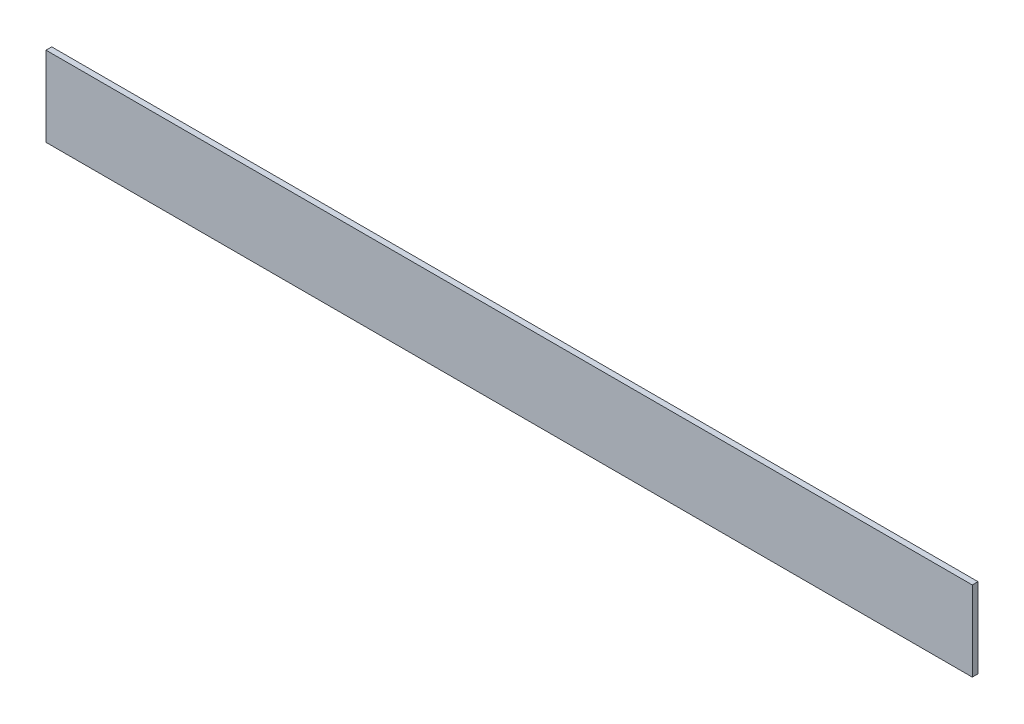
ISO-10303-21;
HEADER;
FILE_DESCRIPTION(('STEP AP214'),'2;1');
FILE_NAME('part.step','',(''),(''),'','','');
FILE_SCHEMA(('AUTOMOTIVE_DESIGN { 1 0 10303 214 1 1 1 1 }'));
ENDSEC;
DATA;
#1=APPLICATION_CONTEXT('core data for automotive mechanical design processes');
#2=APPLICATION_PROTOCOL_DEFINITION('international standard','automotive_design',2000,#1);
#3=PRODUCT_CONTEXT('',#1,'mechanical');
#4=PRODUCT('Part','Part','',(#3));
#5=PRODUCT_RELATED_PRODUCT_CATEGORY('part','',(#4));
#6=PRODUCT_DEFINITION_FORMATION('','',#4);
#7=PRODUCT_DEFINITION_CONTEXT('part definition',#1,'design');
#8=PRODUCT_DEFINITION('design','',#6,#7);
#9=PRODUCT_DEFINITION_SHAPE('','',#8);
#10=(LENGTH_UNIT() NAMED_UNIT(*) SI_UNIT(.MILLI.,.METRE.));
#11=(NAMED_UNIT(*) PLANE_ANGLE_UNIT() SI_UNIT($,.RADIAN.));
#12=(NAMED_UNIT(*) SI_UNIT($,.STERADIAN.) SOLID_ANGLE_UNIT());
#13=UNCERTAINTY_MEASURE_WITH_UNIT(LENGTH_MEASURE(1.E-05),#10,'distance_accuracy_value','');
#14=(GEOMETRIC_REPRESENTATION_CONTEXT(3) GLOBAL_UNCERTAINTY_ASSIGNED_CONTEXT((#13)) GLOBAL_UNIT_ASSIGNED_CONTEXT((#10,
#11,#12)) REPRESENTATION_CONTEXT('',''));
#15=CARTESIAN_POINT('',(0.,0.,0.));
#16=DIRECTION('',(0.,0.,1.));
#17=DIRECTION('',(1.,0.,0.));
#18=AXIS2_PLACEMENT_3D('',#15,#16,#17);
#19=CARTESIAN_POINT('',(-1.4210854715202E-13,-5.19584375524573E-13,0.));
#20=DIRECTION('',(0.,0.,1.));
#21=DIRECTION('',(1.,0.,0.));
#22=AXIS2_PLACEMENT_3D('',#19,#20,#21);
#23=PLANE('',#22);
#24=DIRECTION('',(1.,0.,0.));
#25=VECTOR('',#24,1.);
#26=CARTESIAN_POINT('',(-406.,-35.000000000001,0.));
#27=LINE('',#26,#25);
#28=CARTESIAN_POINT('',(-406.,-35.000000000001,0.));
#29=VERTEX_POINT('',#28);
#30=CARTESIAN_POINT('',(406.,-35.,0.));
#31=VERTEX_POINT('',#30);
#32=EDGE_CURVE('E25',#29,#31,#27,.T.);
#33=ORIENTED_EDGE('',*,*,#32,.F.);
#34=DIRECTION('',(0.,-1.,0.));
#35=VECTOR('',#34,1.);
#36=CARTESIAN_POINT('',(-406.,34.999999999999,0.));
#37=LINE('',#36,#35);
#38=CARTESIAN_POINT('',(-406.,34.999999999999,0.));
#39=VERTEX_POINT('',#38);
#40=EDGE_CURVE('E86',#39,#29,#37,.T.);
#41=ORIENTED_EDGE('',*,*,#40,.F.);
#42=DIRECTION('',(-1.,0.,0.));
#43=VECTOR('',#42,1.);
#44=CARTESIAN_POINT('',(406.,35.,0.));
#45=LINE('',#44,#43);
#46=CARTESIAN_POINT('',(406.,35.,0.));
#47=VERTEX_POINT('',#46);
#48=EDGE_CURVE('E69',#47,#39,#45,.T.);
#49=ORIENTED_EDGE('',*,*,#48,.F.);
#50=DIRECTION('',(0.,1.,0.));
#51=VECTOR('',#50,1.);
#52=CARTESIAN_POINT('',(406.,-35.,0.));
#53=LINE('',#52,#51);
#54=EDGE_CURVE('E103',#31,#47,#53,.T.);
#55=ORIENTED_EDGE('',*,*,#54,.F.);
#56=EDGE_LOOP('',(#33,#41,#49,#55));
#57=FACE_BOUND('',#56,.T.);
#58=ADVANCED_FACE('F17',(#57),#23,.F.);
#59=CARTESIAN_POINT('',(-1.4210854715202E-13,-5.19584375524573E-13,5.));
#60=DIRECTION('',(0.,0.,1.));
#61=DIRECTION('',(1.,0.,0.));
#62=AXIS2_PLACEMENT_3D('',#59,#60,#61);
#63=PLANE('',#62);
#64=DIRECTION('',(1.,0.,0.));
#65=VECTOR('',#64,1.);
#66=CARTESIAN_POINT('',(-406.,-35.000000000001,5.));
#67=LINE('',#66,#65);
#68=CARTESIAN_POINT('',(-406.,-35.000000000001,5.));
#69=VERTEX_POINT('',#68);
#70=CARTESIAN_POINT('',(406.,-35.,5.));
#71=VERTEX_POINT('',#70);
#72=EDGE_CURVE('E11',#69,#71,#67,.T.);
#73=ORIENTED_EDGE('',*,*,#72,.T.);
#74=DIRECTION('',(0.,1.,0.));
#75=VECTOR('',#74,1.);
#76=CARTESIAN_POINT('',(406.,-35.,5.));
#77=LINE('',#76,#75);
#78=CARTESIAN_POINT('',(406.,35.,5.));
#79=VERTEX_POINT('',#78);
#80=EDGE_CURVE('E112',#71,#79,#77,.T.);
#81=ORIENTED_EDGE('',*,*,#80,.T.);
#82=DIRECTION('',(-1.,0.,0.));
#83=VECTOR('',#82,1.);
#84=CARTESIAN_POINT('',(406.,35.,5.));
#85=LINE('',#84,#83);
#86=CARTESIAN_POINT('',(-406.,34.999999999999,5.));
#87=VERTEX_POINT('',#86);
#88=EDGE_CURVE('E85',#79,#87,#85,.T.);
#89=ORIENTED_EDGE('',*,*,#88,.T.);
#90=DIRECTION('',(0.,-1.,0.));
#91=VECTOR('',#90,1.);
#92=CARTESIAN_POINT('',(-406.,34.999999999999,5.));
#93=LINE('',#92,#91);
#94=EDGE_CURVE('E90',#87,#69,#93,.T.);
#95=ORIENTED_EDGE('',*,*,#94,.T.);
#96=EDGE_LOOP('',(#73,#81,#89,#95));
#97=FACE_BOUND('',#96,.T.);
#98=ADVANCED_FACE('F158',(#97),#63,.T.);
#99=CARTESIAN_POINT('',(-406.,-35.000000000001,0.));
#100=DIRECTION('',(0.,-1.,0.));
#101=DIRECTION('',(0.,0.,-1.));
#102=AXIS2_PLACEMENT_3D('',#99,#100,#101);
#103=PLANE('',#102);
#104=ORIENTED_EDGE('',*,*,#32,.T.);
#105=DIRECTION('',(0.,0.,1.));
#106=VECTOR('',#105,1.);
#107=CARTESIAN_POINT('',(406.,-35.,0.));
#108=LINE('',#107,#106);
#109=EDGE_CURVE('E107',#31,#71,#108,.T.);
#110=ORIENTED_EDGE('',*,*,#109,.T.);
#111=ORIENTED_EDGE('',*,*,#72,.F.);
#112=DIRECTION('',(0.,0.,1.));
#113=VECTOR('',#112,1.);
#114=CARTESIAN_POINT('',(-406.,-35.000000000001,0.));
#115=LINE('',#114,#113);
#116=EDGE_CURVE('E91',#29,#69,#115,.T.);
#117=ORIENTED_EDGE('',*,*,#116,.F.);
#118=EDGE_LOOP('',(#104,#110,#111,#117));
#119=FACE_BOUND('',#118,.T.);
#120=ADVANCED_FACE('F164',(#119),#103,.T.);
#121=CARTESIAN_POINT('',(406.,-35.,0.));
#122=DIRECTION('',(1.,0.,0.));
#123=DIRECTION('',(0.,1.,0.));
#124=AXIS2_PLACEMENT_3D('',#121,#122,#123);
#125=PLANE('',#124);
#126=ORIENTED_EDGE('',*,*,#54,.T.);
#127=DIRECTION('',(0.,0.,1.));
#128=VECTOR('',#127,1.);
#129=CARTESIAN_POINT('',(406.,35.,0.));
#130=LINE('',#129,#128);
#131=EDGE_CURVE('E80',#47,#79,#130,.T.);
#132=ORIENTED_EDGE('',*,*,#131,.T.);
#133=ORIENTED_EDGE('',*,*,#80,.F.);
#134=ORIENTED_EDGE('',*,*,#109,.F.);
#135=EDGE_LOOP('',(#126,#132,#133,#134));
#136=FACE_BOUND('',#135,.T.);
#137=ADVANCED_FACE('F172',(#136),#125,.T.);
#138=CARTESIAN_POINT('',(406.,35.,0.));
#139=DIRECTION('',(0.,1.,0.));
#140=DIRECTION('',(1.,0.,0.));
#141=AXIS2_PLACEMENT_3D('',#138,#139,#140);
#142=PLANE('',#141);
#143=ORIENTED_EDGE('',*,*,#48,.T.);
#144=DIRECTION('',(0.,0.,1.));
#145=VECTOR('',#144,1.);
#146=CARTESIAN_POINT('',(-406.,34.999999999999,0.));
#147=LINE('',#146,#145);
#148=EDGE_CURVE('E72',#39,#87,#147,.T.);
#149=ORIENTED_EDGE('',*,*,#148,.T.);
#150=ORIENTED_EDGE('',*,*,#88,.F.);
#151=ORIENTED_EDGE('',*,*,#131,.F.);
#152=EDGE_LOOP('',(#143,#149,#150,#151));
#153=FACE_BOUND('',#152,.T.);
#154=ADVANCED_FACE('F71',(#153),#142,.T.);
#155=CARTESIAN_POINT('',(-406.,34.999999999999,0.));
#156=DIRECTION('',(-1.,0.,0.));
#157=DIRECTION('',(0.,1.,0.));
#158=AXIS2_PLACEMENT_3D('',#155,#156,#157);
#159=PLANE('',#158);
#160=ORIENTED_EDGE('',*,*,#40,.T.);
#161=ORIENTED_EDGE('',*,*,#116,.T.);
#162=ORIENTED_EDGE('',*,*,#94,.F.);
#163=ORIENTED_EDGE('',*,*,#148,.F.);
#164=EDGE_LOOP('',(#160,#161,#162,#163));
#165=FACE_BOUND('',#164,.T.);
#166=ADVANCED_FACE('F88',(#165),#159,.T.);
#167=CLOSED_SHELL('',(#58,#98,#120,#137,#154,#166));
#168=MANIFOLD_SOLID_BREP('B1',#167);
#169=ADVANCED_BREP_SHAPE_REPRESENTATION('',(#18,#168),#14);
#170=SHAPE_DEFINITION_REPRESENTATION(#9,#169);
ENDSEC;
END-ISO-10303-21;
